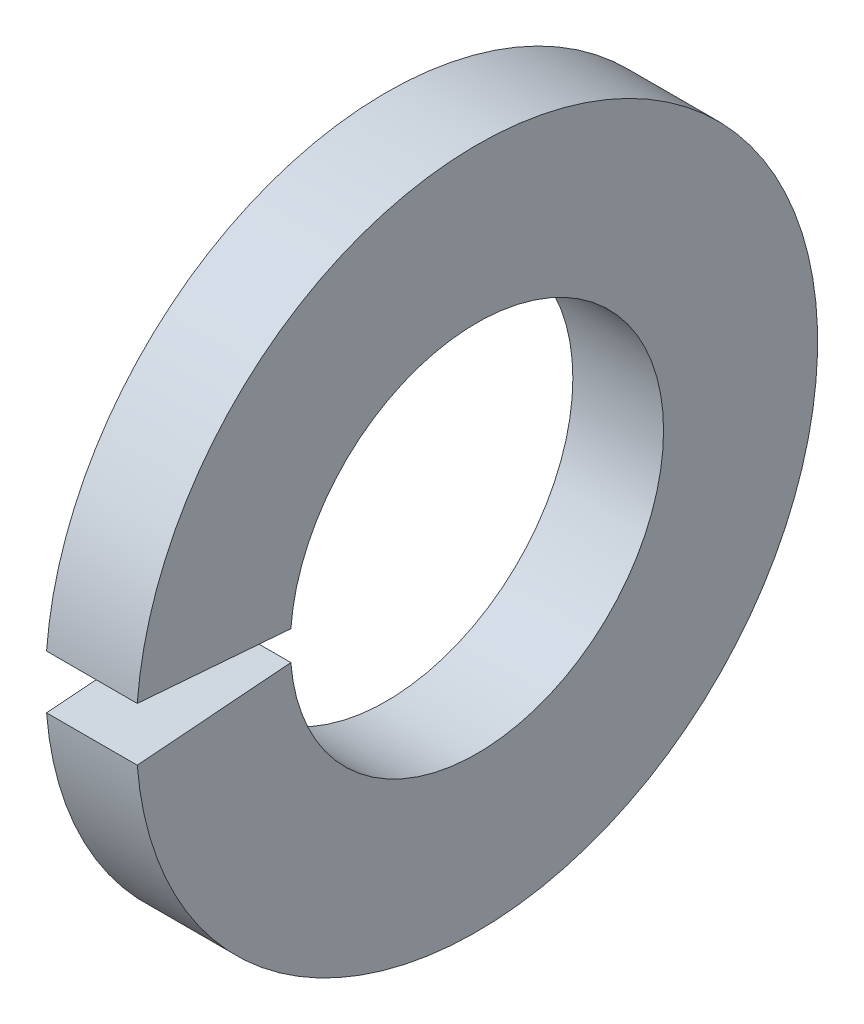
ISO-10303-21;
HEADER;
FILE_DESCRIPTION(('STEP AP214'),'2;1');
FILE_NAME('part.step','',(''),(''),'','','');
FILE_SCHEMA(('AUTOMOTIVE_DESIGN { 1 0 10303 214 1 1 1 1 }'));
ENDSEC;
DATA;
#1=APPLICATION_CONTEXT('core data for automotive mechanical design processes');
#2=APPLICATION_PROTOCOL_DEFINITION('international standard','automotive_design',2000,#1);
#3=PRODUCT_CONTEXT('',#1,'mechanical');
#4=PRODUCT('Part','Part','',(#3));
#5=PRODUCT_RELATED_PRODUCT_CATEGORY('part','',(#4));
#6=PRODUCT_DEFINITION_FORMATION('','',#4);
#7=PRODUCT_DEFINITION_CONTEXT('part definition',#1,'design');
#8=PRODUCT_DEFINITION('design','',#6,#7);
#9=PRODUCT_DEFINITION_SHAPE('','',#8);
#10=(LENGTH_UNIT() NAMED_UNIT(*) SI_UNIT(.MILLI.,.METRE.));
#11=(NAMED_UNIT(*) PLANE_ANGLE_UNIT() SI_UNIT($,.RADIAN.));
#12=(NAMED_UNIT(*) SI_UNIT($,.STERADIAN.) SOLID_ANGLE_UNIT());
#13=UNCERTAINTY_MEASURE_WITH_UNIT(LENGTH_MEASURE(1.E-05),#10,'distance_accuracy_value','');
#14=(GEOMETRIC_REPRESENTATION_CONTEXT(3) GLOBAL_UNCERTAINTY_ASSIGNED_CONTEXT((#13)) GLOBAL_UNIT_ASSIGNED_CONTEXT((#10,
#11,#12)) REPRESENTATION_CONTEXT('',''));
#15=CARTESIAN_POINT('',(0.,0.,0.));
#16=DIRECTION('',(0.,0.,1.));
#17=DIRECTION('',(1.,0.,0.));
#18=AXIS2_PLACEMENT_3D('',#15,#16,#17);
#19=CARTESIAN_POINT('',(-34.9249999999999,0.,0.));
#20=DIRECTION('',(-1.,0.,0.));
#21=DIRECTION('',(0.,0.,1.));
#22=AXIS2_PLACEMENT_3D('',#19,#20,#21);
#23=CYLINDRICAL_SURFACE('',#22,4.0767);
#24=CARTESIAN_POINT('',(0.,0.,0.));
#25=DIRECTION('',(-1.,0.,0.));
#26=DIRECTION('',(0.,0.,1.));
#27=AXIS2_PLACEMENT_3D('',#24,#25,#26);
#28=CIRCLE('',#27,4.0767);
#29=CARTESIAN_POINT('',(0.,0.319854195553708,4.06413289442984));
#30=VERTEX_POINT('',#29);
#31=CARTESIAN_POINT('',(0.,-0.319854195553708,4.06413289442984));
#32=VERTEX_POINT('',#31);
#33=EDGE_CURVE('E84',#30,#32,#28,.T.);
#34=ORIENTED_EDGE('',*,*,#33,.F.);
#35=DIRECTION('',(-1.,0.,0.));
#36=VECTOR('',#35,1.);
#37=CARTESIAN_POINT('',(-34.9249999999999,0.319854195553708,4.06413289442984));
#38=LINE('',#37,#36);
#39=CARTESIAN_POINT('',(-1.9812,0.319854195553708,4.06413289442984));
#40=VERTEX_POINT('',#39);
#41=EDGE_CURVE('E98',#30,#40,#38,.T.);
#42=ORIENTED_EDGE('',*,*,#41,.T.);
#43=CARTESIAN_POINT('',(-1.9812,0.,0.));
#44=DIRECTION('',(-1.,0.,0.));
#45=DIRECTION('',(0.,0.,1.));
#46=AXIS2_PLACEMENT_3D('',#43,#44,#45);
#47=CIRCLE('',#46,4.0767);
#48=CARTESIAN_POINT('',(-1.9812,-0.319854195553707,4.06413289442984));
#49=VERTEX_POINT('',#48);
#50=EDGE_CURVE('E86',#40,#49,#47,.T.);
#51=ORIENTED_EDGE('',*,*,#50,.T.);
#52=DIRECTION('',(-1.,0.,0.));
#53=VECTOR('',#52,1.);
#54=CARTESIAN_POINT('',(-34.9249999999999,-0.319854195553708,4.06413289442984));
#55=LINE('',#54,#53);
#56=EDGE_CURVE('E54',#32,#49,#55,.T.);
#57=ORIENTED_EDGE('',*,*,#56,.F.);
#58=EDGE_LOOP('',(#34,#42,#51,#57));
#59=FACE_BOUND('',#58,.T.);
#60=ADVANCED_FACE('F33',(#59),#23,.F.);
#61=CARTESIAN_POINT('',(0.,4.0767,0.));
#62=DIRECTION('',(-1.,0.,0.));
#63=DIRECTION('',(0.,0.,1.));
#64=AXIS2_PLACEMENT_3D('',#61,#62,#63);
#65=PLANE('',#64);
#66=CARTESIAN_POINT('',(0.,0.,0.));
#67=DIRECTION('',(-1.,0.,0.));
#68=DIRECTION('',(0.,0.,1.));
#69=AXIS2_PLACEMENT_3D('',#66,#67,#68);
#70=CIRCLE('',#69,7.4422);
#71=CARTESIAN_POINT('',(0.,0.583908282225773,7.41925818110868));
#72=VERTEX_POINT('',#71);
#73=CARTESIAN_POINT('',(0.,-0.583908282225773,7.41925818110868));
#74=VERTEX_POINT('',#73);
#75=EDGE_CURVE('E90',#72,#74,#70,.T.);
#76=ORIENTED_EDGE('',*,*,#75,.F.);
#77=DIRECTION('',(0.,0.0784590957278456,0.996917333733128));
#78=VECTOR('',#77,1.);
#79=CARTESIAN_POINT('',(0.,0.,0.));
#80=LINE('',#79,#78);
#81=EDGE_CURVE('E78',#30,#72,#80,.T.);
#82=ORIENTED_EDGE('',*,*,#81,.F.);
#83=ORIENTED_EDGE('',*,*,#33,.T.);
#84=DIRECTION('',(0.,-0.0784590957278456,0.996917333733128));
#85=VECTOR('',#84,1.);
#86=CARTESIAN_POINT('',(0.,0.,0.));
#87=LINE('',#86,#85);
#88=EDGE_CURVE('E70',#32,#74,#87,.T.);
#89=ORIENTED_EDGE('',*,*,#88,.T.);
#90=EDGE_LOOP('',(#76,#82,#83,#89));
#91=FACE_BOUND('',#90,.T.);
#92=ADVANCED_FACE('F89',(#91),#65,.F.);
#93=CARTESIAN_POINT('',(-34.9249999999999,0.,0.));
#94=DIRECTION('',(-1.,0.,0.));
#95=DIRECTION('',(0.,0.,1.));
#96=AXIS2_PLACEMENT_3D('',#93,#94,#95);
#97=CYLINDRICAL_SURFACE('',#96,7.4422);
#98=CARTESIAN_POINT('',(-1.9812,0.,0.));
#99=DIRECTION('',(-1.,0.,0.));
#100=DIRECTION('',(0.,0.,1.));
#101=AXIS2_PLACEMENT_3D('',#98,#99,#100);
#102=CIRCLE('',#101,7.4422);
#103=CARTESIAN_POINT('',(-1.9812,0.583908282225774,7.41925818110868));
#104=VERTEX_POINT('',#103);
#105=CARTESIAN_POINT('',(-1.9812,-0.583908282225773,7.41925818110868));
#106=VERTEX_POINT('',#105);
#107=EDGE_CURVE('E92',#104,#106,#102,.T.);
#108=ORIENTED_EDGE('',*,*,#107,.F.);
#109=DIRECTION('',(-1.,0.,0.));
#110=VECTOR('',#109,1.);
#111=CARTESIAN_POINT('',(-34.9249999999999,0.583908282225773,7.41925818110868));
#112=LINE('',#111,#110);
#113=EDGE_CURVE('E47',#104,#72,#112,.F.);
#114=ORIENTED_EDGE('',*,*,#113,.T.);
#115=ORIENTED_EDGE('',*,*,#75,.T.);
#116=DIRECTION('',(-1.,0.,0.));
#117=VECTOR('',#116,1.);
#118=CARTESIAN_POINT('',(-34.9249999999999,-0.583908282225773,7.41925818110868));
#119=LINE('',#118,#117);
#120=EDGE_CURVE('E73',#106,#74,#119,.F.);
#121=ORIENTED_EDGE('',*,*,#120,.F.);
#122=EDGE_LOOP('',(#108,#114,#115,#121));
#123=FACE_BOUND('',#122,.T.);
#124=ADVANCED_FACE('F105',(#123),#97,.T.);
#125=CARTESIAN_POINT('',(-1.9812,7.4422,0.));
#126=DIRECTION('',(1.,0.,0.));
#127=DIRECTION('',(0.,0.,-1.));
#128=AXIS2_PLACEMENT_3D('',#125,#126,#127);
#129=PLANE('',#128);
#130=ORIENTED_EDGE('',*,*,#50,.F.);
#131=DIRECTION('',(0.,0.0784590957278456,0.996917333733128));
#132=VECTOR('',#131,1.);
#133=CARTESIAN_POINT('',(-1.9812,0.0458129158114355,0.582108287861208));
#134=LINE('',#133,#132);
#135=EDGE_CURVE('E11',#40,#104,#134,.T.);
#136=ORIENTED_EDGE('',*,*,#135,.T.);
#137=ORIENTED_EDGE('',*,*,#107,.T.);
#138=DIRECTION('',(0.,-0.0784590957278456,0.996917333733128));
#139=VECTOR('',#138,1.);
#140=CARTESIAN_POINT('',(-1.9812,0.0458129158114355,-0.582108287861208));
#141=LINE('',#140,#139);
#142=EDGE_CURVE('E40',#49,#106,#141,.T.);
#143=ORIENTED_EDGE('',*,*,#142,.F.);
#144=EDGE_LOOP('',(#130,#136,#137,#143));
#145=FACE_BOUND('',#144,.T.);
#146=ADVANCED_FACE('F107',(#145),#129,.F.);
#147=CARTESIAN_POINT('',(-1.9812,0.,0.));
#148=DIRECTION('',(0.,0.996917333733128,0.0784590957278456));
#149=DIRECTION('',(0.,-0.0784590957278456,0.996917333733128));
#150=AXIS2_PLACEMENT_3D('',#147,#148,#149);
#151=PLANE('',#150);
#152=ORIENTED_EDGE('',*,*,#56,.T.);
#153=ORIENTED_EDGE('',*,*,#142,.T.);
#154=ORIENTED_EDGE('',*,*,#120,.T.);
#155=ORIENTED_EDGE('',*,*,#88,.F.);
#156=EDGE_LOOP('',(#152,#153,#154,#155));
#157=FACE_BOUND('',#156,.T.);
#158=ADVANCED_FACE('F71',(#157),#151,.T.);
#159=CARTESIAN_POINT('',(-1.9812,0.,0.));
#160=DIRECTION('',(0.,0.996917333733128,-0.0784590957278456));
#161=DIRECTION('',(0.,0.0784590957278456,0.996917333733128));
#162=AXIS2_PLACEMENT_3D('',#159,#160,#161);
#163=PLANE('',#162);
#164=ORIENTED_EDGE('',*,*,#81,.T.);
#165=ORIENTED_EDGE('',*,*,#113,.F.);
#166=ORIENTED_EDGE('',*,*,#135,.F.);
#167=ORIENTED_EDGE('',*,*,#41,.F.);
#168=EDGE_LOOP('',(#164,#165,#166,#167));
#169=FACE_BOUND('',#168,.T.);
#170=ADVANCED_FACE('F102',(#169),#163,.F.);
#171=CLOSED_SHELL('',(#60,#92,#124,#146,#158,#170));
#172=MANIFOLD_SOLID_BREP('B2',#171);
#173=ADVANCED_BREP_SHAPE_REPRESENTATION('',(#18,#172),#14);
#174=SHAPE_DEFINITION_REPRESENTATION(#9,#173);
ENDSEC;
END-ISO-10303-21;
